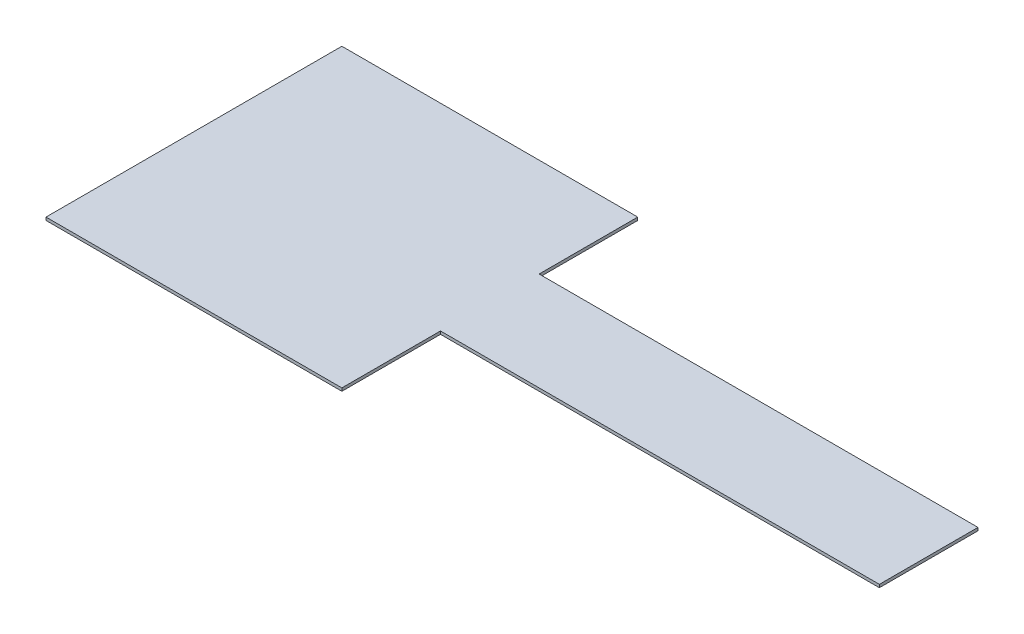
ISO-10303-21;
HEADER;
FILE_DESCRIPTION(('STEP AP214'),'2;1');
FILE_NAME('part.step','',(''),(''),'','','');
FILE_SCHEMA(('AUTOMOTIVE_DESIGN { 1 0 10303 214 1 1 1 1 }'));
ENDSEC;
DATA;
#1=APPLICATION_CONTEXT('core data for automotive mechanical design processes');
#2=APPLICATION_PROTOCOL_DEFINITION('international standard','automotive_design',2000,#1);
#3=PRODUCT_CONTEXT('',#1,'mechanical');
#4=PRODUCT('Part','Part','',(#3));
#5=PRODUCT_RELATED_PRODUCT_CATEGORY('part','',(#4));
#6=PRODUCT_DEFINITION_FORMATION('','',#4);
#7=PRODUCT_DEFINITION_CONTEXT('part definition',#1,'design');
#8=PRODUCT_DEFINITION('design','',#6,#7);
#9=PRODUCT_DEFINITION_SHAPE('','',#8);
#10=(LENGTH_UNIT() NAMED_UNIT(*) SI_UNIT(.MILLI.,.METRE.));
#11=(NAMED_UNIT(*) PLANE_ANGLE_UNIT() SI_UNIT($,.RADIAN.));
#12=(NAMED_UNIT(*) SI_UNIT($,.STERADIAN.) SOLID_ANGLE_UNIT());
#13=UNCERTAINTY_MEASURE_WITH_UNIT(LENGTH_MEASURE(1.E-05),#10,'distance_accuracy_value','');
#14=(GEOMETRIC_REPRESENTATION_CONTEXT(3) GLOBAL_UNCERTAINTY_ASSIGNED_CONTEXT((#13)) GLOBAL_UNIT_ASSIGNED_CONTEXT((#10,
#11,#12)) REPRESENTATION_CONTEXT('',''));
#15=CARTESIAN_POINT('',(0.,0.,0.));
#16=DIRECTION('',(0.,0.,1.));
#17=DIRECTION('',(1.,0.,0.));
#18=AXIS2_PLACEMENT_3D('',#15,#16,#17);
#19=CARTESIAN_POINT('',(0.,0.0001,-15.));
#20=DIRECTION('',(1.,0.,0.));
#21=DIRECTION('',(0.,0.,-1.));
#22=AXIS2_PLACEMENT_3D('',#19,#20,#21);
#23=PLANE('',#22);
#24=DIRECTION('',(0.,-1.,0.));
#25=VECTOR('',#24,1.);
#26=CARTESIAN_POINT('',(0.,0.0001,-15.));
#27=LINE('',#26,#25);
#28=CARTESIAN_POINT('',(0.,0.0001,-15.));
#29=VERTEX_POINT('',#28);
#30=CARTESIAN_POINT('',(0.,-0.3,-15.));
#31=VERTEX_POINT('',#30);
#32=EDGE_CURVE('E122',#29,#31,#27,.T.);
#33=ORIENTED_EDGE('',*,*,#32,.T.);
#34=DIRECTION('',(0.,0.,1.));
#35=VECTOR('',#34,1.);
#36=CARTESIAN_POINT('',(0.,-0.3,-15.));
#37=LINE('',#36,#35);
#38=CARTESIAN_POINT('',(0.,-0.3,15.));
#39=VERTEX_POINT('',#38);
#40=EDGE_CURVE('E116',#31,#39,#37,.T.);
#41=ORIENTED_EDGE('',*,*,#40,.T.);
#42=DIRECTION('',(0.,-1.,0.));
#43=VECTOR('',#42,1.);
#44=CARTESIAN_POINT('',(0.,0.0001,15.));
#45=LINE('',#44,#43);
#46=CARTESIAN_POINT('',(0.,0.0001,15.));
#47=VERTEX_POINT('',#46);
#48=EDGE_CURVE('E11',#47,#39,#45,.T.);
#49=ORIENTED_EDGE('',*,*,#48,.F.);
#50=DIRECTION('',(0.,0.,1.));
#51=VECTOR('',#50,1.);
#52=CARTESIAN_POINT('',(0.,0.0001,-15.));
#53=LINE('',#52,#51);
#54=EDGE_CURVE('E140',#29,#47,#53,.T.);
#55=ORIENTED_EDGE('',*,*,#54,.F.);
#56=EDGE_LOOP('',(#33,#41,#49,#55));
#57=FACE_BOUND('',#56,.T.);
#58=ADVANCED_FACE('F40',(#57),#23,.F.);
#59=CARTESIAN_POINT('',(0.,0.0001,15.));
#60=DIRECTION('',(0.,0.,-1.));
#61=DIRECTION('',(-1.,0.,0.));
#62=AXIS2_PLACEMENT_3D('',#59,#60,#61);
#63=PLANE('',#62);
#64=ORIENTED_EDGE('',*,*,#48,.T.);
#65=DIRECTION('',(1.,0.,0.));
#66=VECTOR('',#65,1.);
#67=CARTESIAN_POINT('',(0.,-0.3,15.));
#68=LINE('',#67,#66);
#69=CARTESIAN_POINT('',(30.,-0.3,15.));
#70=VERTEX_POINT('',#69);
#71=EDGE_CURVE('E106',#39,#70,#68,.T.);
#72=ORIENTED_EDGE('',*,*,#71,.T.);
#73=DIRECTION('',(0.,-1.,0.));
#74=VECTOR('',#73,1.);
#75=CARTESIAN_POINT('',(30.,0.0001,15.));
#76=LINE('',#75,#74);
#77=CARTESIAN_POINT('',(30.,0.0001,15.));
#78=VERTEX_POINT('',#77);
#79=EDGE_CURVE('E47',#78,#70,#76,.T.);
#80=ORIENTED_EDGE('',*,*,#79,.F.);
#81=DIRECTION('',(1.,0.,0.));
#82=VECTOR('',#81,1.);
#83=CARTESIAN_POINT('',(0.,0.0001,15.));
#84=LINE('',#83,#82);
#85=EDGE_CURVE('E107',#47,#78,#84,.T.);
#86=ORIENTED_EDGE('',*,*,#85,.F.);
#87=EDGE_LOOP('',(#64,#72,#80,#86));
#88=FACE_BOUND('',#87,.T.);
#89=ADVANCED_FACE('F104',(#88),#63,.F.);
#90=CARTESIAN_POINT('',(30.,0.0001,15.));
#91=DIRECTION('',(-1.,0.,0.));
#92=DIRECTION('',(0.,0.,1.));
#93=AXIS2_PLACEMENT_3D('',#90,#91,#92);
#94=PLANE('',#93);
#95=ORIENTED_EDGE('',*,*,#79,.T.);
#96=DIRECTION('',(0.,0.,-1.));
#97=VECTOR('',#96,1.);
#98=CARTESIAN_POINT('',(30.,-0.3,15.));
#99=LINE('',#98,#97);
#100=CARTESIAN_POINT('',(30.,-0.3,5.));
#101=VERTEX_POINT('',#100);
#102=EDGE_CURVE('E120',#70,#101,#99,.T.);
#103=ORIENTED_EDGE('',*,*,#102,.T.);
#104=DIRECTION('',(0.,-1.,0.));
#105=VECTOR('',#104,1.);
#106=CARTESIAN_POINT('',(30.,0.0001,5.));
#107=LINE('',#106,#105);
#108=CARTESIAN_POINT('',(30.,0.0001,5.));
#109=VERTEX_POINT('',#108);
#110=EDGE_CURVE('E162',#109,#101,#107,.T.);
#111=ORIENTED_EDGE('',*,*,#110,.F.);
#112=DIRECTION('',(0.,0.,-1.));
#113=VECTOR('',#112,1.);
#114=CARTESIAN_POINT('',(30.,0.0001,15.));
#115=LINE('',#114,#113);
#116=EDGE_CURVE('E143',#78,#109,#115,.T.);
#117=ORIENTED_EDGE('',*,*,#116,.F.);
#118=EDGE_LOOP('',(#95,#103,#111,#117));
#119=FACE_BOUND('',#118,.T.);
#120=ADVANCED_FACE('F165',(#119),#94,.F.);
#121=CARTESIAN_POINT('',(30.,0.0001,5.));
#122=DIRECTION('',(0.,0.,-1.));
#123=DIRECTION('',(-1.,0.,0.));
#124=AXIS2_PLACEMENT_3D('',#121,#122,#123);
#125=PLANE('',#124);
#126=ORIENTED_EDGE('',*,*,#110,.T.);
#127=DIRECTION('',(1.,0.,0.));
#128=VECTOR('',#127,1.);
#129=CARTESIAN_POINT('',(30.,-0.3,5.));
#130=LINE('',#129,#128);
#131=CARTESIAN_POINT('',(74.5,-0.3,5.));
#132=VERTEX_POINT('',#131);
#133=EDGE_CURVE('E126',#101,#132,#130,.T.);
#134=ORIENTED_EDGE('',*,*,#133,.T.);
#135=DIRECTION('',(0.,-1.,0.));
#136=VECTOR('',#135,1.);
#137=CARTESIAN_POINT('',(74.5,0.0001,5.));
#138=LINE('',#137,#136);
#139=CARTESIAN_POINT('',(74.5,0.0001,5.));
#140=VERTEX_POINT('',#139);
#141=EDGE_CURVE('E160',#140,#132,#138,.T.);
#142=ORIENTED_EDGE('',*,*,#141,.F.);
#143=DIRECTION('',(1.,0.,0.));
#144=VECTOR('',#143,1.);
#145=CARTESIAN_POINT('',(30.,0.0001,5.));
#146=LINE('',#145,#144);
#147=EDGE_CURVE('E145',#109,#140,#146,.T.);
#148=ORIENTED_EDGE('',*,*,#147,.F.);
#149=EDGE_LOOP('',(#126,#134,#142,#148));
#150=FACE_BOUND('',#149,.T.);
#151=ADVANCED_FACE('F173',(#150),#125,.F.);
#152=CARTESIAN_POINT('',(74.5,0.0001,-5.));
#153=DIRECTION('',(-1.,0.,0.));
#154=DIRECTION('',(0.,0.,1.));
#155=AXIS2_PLACEMENT_3D('',#152,#153,#154);
#156=PLANE('',#155);
#157=ORIENTED_EDGE('',*,*,#141,.T.);
#158=DIRECTION('',(0.,0.,-1.));
#159=VECTOR('',#158,1.);
#160=CARTESIAN_POINT('',(74.5,-0.3,-5.));
#161=LINE('',#160,#159);
#162=CARTESIAN_POINT('',(74.5,-0.3,-5.));
#163=VERTEX_POINT('',#162);
#164=EDGE_CURVE('E129',#132,#163,#161,.T.);
#165=ORIENTED_EDGE('',*,*,#164,.T.);
#166=DIRECTION('',(0.,-1.,0.));
#167=VECTOR('',#166,1.);
#168=CARTESIAN_POINT('',(74.5,0.0001,-5.));
#169=LINE('',#168,#167);
#170=CARTESIAN_POINT('',(74.5,0.0001,-5.));
#171=VERTEX_POINT('',#170);
#172=EDGE_CURVE('E158',#171,#163,#169,.T.);
#173=ORIENTED_EDGE('',*,*,#172,.F.);
#174=DIRECTION('',(0.,0.,-1.));
#175=VECTOR('',#174,1.);
#176=CARTESIAN_POINT('',(74.5,0.0001,-5.));
#177=LINE('',#176,#175);
#178=EDGE_CURVE('E147',#140,#171,#177,.T.);
#179=ORIENTED_EDGE('',*,*,#178,.F.);
#180=EDGE_LOOP('',(#157,#165,#173,#179));
#181=FACE_BOUND('',#180,.T.);
#182=ADVANCED_FACE('F176',(#181),#156,.F.);
#183=CARTESIAN_POINT('',(30.,0.0001,-5.));
#184=DIRECTION('',(0.,0.,1.));
#185=DIRECTION('',(1.,0.,0.));
#186=AXIS2_PLACEMENT_3D('',#183,#184,#185);
#187=PLANE('',#186);
#188=ORIENTED_EDGE('',*,*,#172,.T.);
#189=DIRECTION('',(-1.,0.,0.));
#190=VECTOR('',#189,1.);
#191=CARTESIAN_POINT('',(30.,-0.3,-5.));
#192=LINE('',#191,#190);
#193=CARTESIAN_POINT('',(30.,-0.3,-5.));
#194=VERTEX_POINT('',#193);
#195=EDGE_CURVE('E132',#163,#194,#192,.T.);
#196=ORIENTED_EDGE('',*,*,#195,.T.);
#197=DIRECTION('',(0.,-1.,0.));
#198=VECTOR('',#197,1.);
#199=CARTESIAN_POINT('',(30.,0.0001,-5.));
#200=LINE('',#199,#198);
#201=CARTESIAN_POINT('',(30.,0.0001,-5.));
#202=VERTEX_POINT('',#201);
#203=EDGE_CURVE('E156',#202,#194,#200,.T.);
#204=ORIENTED_EDGE('',*,*,#203,.F.);
#205=DIRECTION('',(-1.,0.,0.));
#206=VECTOR('',#205,1.);
#207=CARTESIAN_POINT('',(30.,0.0001,-5.));
#208=LINE('',#207,#206);
#209=EDGE_CURVE('E149',#171,#202,#208,.T.);
#210=ORIENTED_EDGE('',*,*,#209,.F.);
#211=EDGE_LOOP('',(#188,#196,#204,#210));
#212=FACE_BOUND('',#211,.T.);
#213=ADVANCED_FACE('F181',(#212),#187,.F.);
#214=CARTESIAN_POINT('',(30.,0.0001,-15.));
#215=DIRECTION('',(-1.,0.,0.));
#216=DIRECTION('',(0.,0.,1.));
#217=AXIS2_PLACEMENT_3D('',#214,#215,#216);
#218=PLANE('',#217);
#219=ORIENTED_EDGE('',*,*,#203,.T.);
#220=DIRECTION('',(0.,0.,-1.));
#221=VECTOR('',#220,1.);
#222=CARTESIAN_POINT('',(30.,-0.3,-15.));
#223=LINE('',#222,#221);
#224=CARTESIAN_POINT('',(30.,-0.3,-15.));
#225=VERTEX_POINT('',#224);
#226=EDGE_CURVE('E135',#194,#225,#223,.T.);
#227=ORIENTED_EDGE('',*,*,#226,.T.);
#228=DIRECTION('',(0.,-1.,0.));
#229=VECTOR('',#228,1.);
#230=CARTESIAN_POINT('',(30.,0.0001,-15.));
#231=LINE('',#230,#229);
#232=CARTESIAN_POINT('',(30.,0.0001,-15.));
#233=VERTEX_POINT('',#232);
#234=EDGE_CURVE('E154',#233,#225,#231,.T.);
#235=ORIENTED_EDGE('',*,*,#234,.F.);
#236=DIRECTION('',(0.,0.,-1.));
#237=VECTOR('',#236,1.);
#238=CARTESIAN_POINT('',(30.,0.0001,-15.));
#239=LINE('',#238,#237);
#240=EDGE_CURVE('E59',#202,#233,#239,.T.);
#241=ORIENTED_EDGE('',*,*,#240,.F.);
#242=EDGE_LOOP('',(#219,#227,#235,#241));
#243=FACE_BOUND('',#242,.T.);
#244=ADVANCED_FACE('F184',(#243),#218,.F.);
#245=CARTESIAN_POINT('',(0.,0.0001,-15.));
#246=DIRECTION('',(0.,0.,1.));
#247=DIRECTION('',(1.,0.,0.));
#248=AXIS2_PLACEMENT_3D('',#245,#246,#247);
#249=PLANE('',#248);
#250=ORIENTED_EDGE('',*,*,#234,.T.);
#251=DIRECTION('',(-1.,0.,0.));
#252=VECTOR('',#251,1.);
#253=CARTESIAN_POINT('',(0.,-0.3,-15.));
#254=LINE('',#253,#252);
#255=EDGE_CURVE('E138',#225,#31,#254,.T.);
#256=ORIENTED_EDGE('',*,*,#255,.T.);
#257=ORIENTED_EDGE('',*,*,#32,.F.);
#258=DIRECTION('',(-1.,0.,0.));
#259=VECTOR('',#258,1.);
#260=CARTESIAN_POINT('',(0.,0.0001,-15.));
#261=LINE('',#260,#259);
#262=EDGE_CURVE('E54',#233,#29,#261,.T.);
#263=ORIENTED_EDGE('',*,*,#262,.F.);
#264=EDGE_LOOP('',(#250,#256,#257,#263));
#265=FACE_BOUND('',#264,.T.);
#266=ADVANCED_FACE('F186',(#265),#249,.F.);
#267=CARTESIAN_POINT('',(0.,0.0001,0.));
#268=DIRECTION('',(0.,1.,0.));
#269=DIRECTION('',(0.,0.,1.));
#270=AXIS2_PLACEMENT_3D('',#267,#268,#269);
#271=PLANE('',#270);
#272=ORIENTED_EDGE('',*,*,#54,.T.);
#273=ORIENTED_EDGE('',*,*,#85,.T.);
#274=ORIENTED_EDGE('',*,*,#116,.T.);
#275=ORIENTED_EDGE('',*,*,#147,.T.);
#276=ORIENTED_EDGE('',*,*,#178,.T.);
#277=ORIENTED_EDGE('',*,*,#209,.T.);
#278=ORIENTED_EDGE('',*,*,#240,.T.);
#279=ORIENTED_EDGE('',*,*,#262,.T.);
#280=EDGE_LOOP('',(#272,#273,#274,#275,#276,#277,#278,#279));
#281=FACE_BOUND('',#280,.T.);
#282=ADVANCED_FACE('F168',(#281),#271,.T.);
#283=CARTESIAN_POINT('',(0.,-0.3,0.));
#284=DIRECTION('',(0.,1.,0.));
#285=DIRECTION('',(0.,0.,1.));
#286=AXIS2_PLACEMENT_3D('',#283,#284,#285);
#287=PLANE('',#286);
#288=ORIENTED_EDGE('',*,*,#40,.F.);
#289=ORIENTED_EDGE('',*,*,#255,.F.);
#290=ORIENTED_EDGE('',*,*,#226,.F.);
#291=ORIENTED_EDGE('',*,*,#195,.F.);
#292=ORIENTED_EDGE('',*,*,#164,.F.);
#293=ORIENTED_EDGE('',*,*,#133,.F.);
#294=ORIENTED_EDGE('',*,*,#102,.F.);
#295=ORIENTED_EDGE('',*,*,#71,.F.);
#296=EDGE_LOOP('',(#288,#289,#290,#291,#292,#293,#294,#295));
#297=FACE_BOUND('',#296,.T.);
#298=ADVANCED_FACE('F114',(#297),#287,.F.);
#299=CLOSED_SHELL('',(#58,#89,#120,#151,#182,#213,#244,#266,#282,#298));
#300=MANIFOLD_SOLID_BREP('B2',#299);
#301=ADVANCED_BREP_SHAPE_REPRESENTATION('',(#18,#300),#14);
#302=SHAPE_DEFINITION_REPRESENTATION(#9,#301);
ENDSEC;
END-ISO-10303-21;
